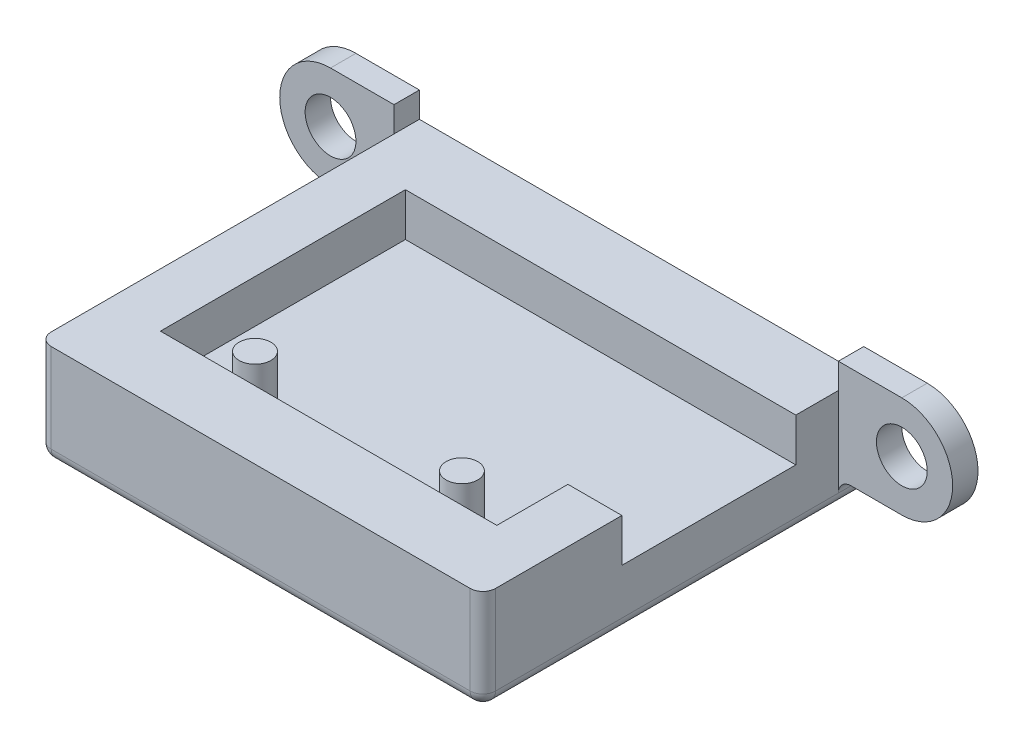
ISO-10303-21;
HEADER;
FILE_DESCRIPTION(('STEP AP214'),'2;1');
FILE_NAME('part.step','',(''),(''),'','','');
FILE_SCHEMA(('AUTOMOTIVE_DESIGN { 1 0 10303 214 1 1 1 1 }'));
ENDSEC;
DATA;
#1=APPLICATION_CONTEXT('core data for automotive mechanical design processes');
#2=APPLICATION_PROTOCOL_DEFINITION('international standard','automotive_design',2000,#1);
#3=PRODUCT_CONTEXT('',#1,'mechanical');
#4=PRODUCT('Part','Part','',(#3));
#5=PRODUCT_RELATED_PRODUCT_CATEGORY('part','',(#4));
#6=PRODUCT_DEFINITION_FORMATION('','',#4);
#7=PRODUCT_DEFINITION_CONTEXT('part definition',#1,'design');
#8=PRODUCT_DEFINITION('design','',#6,#7);
#9=PRODUCT_DEFINITION_SHAPE('','',#8);
#10=(LENGTH_UNIT() NAMED_UNIT(*) SI_UNIT(.MILLI.,.METRE.));
#11=(NAMED_UNIT(*) PLANE_ANGLE_UNIT() SI_UNIT($,.RADIAN.));
#12=(NAMED_UNIT(*) SI_UNIT($,.STERADIAN.) SOLID_ANGLE_UNIT());
#13=UNCERTAINTY_MEASURE_WITH_UNIT(LENGTH_MEASURE(1.E-05),#10,'distance_accuracy_value','');
#14=(GEOMETRIC_REPRESENTATION_CONTEXT(3) GLOBAL_UNCERTAINTY_ASSIGNED_CONTEXT((#13)) GLOBAL_UNIT_ASSIGNED_CONTEXT((#10,
#11,#12)) REPRESENTATION_CONTEXT('',''));
#15=CARTESIAN_POINT('',(0.,0.,0.));
#16=DIRECTION('',(0.,0.,1.));
#17=DIRECTION('',(1.,0.,0.));
#18=AXIS2_PLACEMENT_3D('',#15,#16,#17);
#19=CARTESIAN_POINT('',(17.5,8.,-15.));
#20=DIRECTION('',(-1.,0.,0.));
#21=DIRECTION('',(0.,0.,1.));
#22=AXIS2_PLACEMENT_3D('',#19,#20,#21);
#23=PLANE('',#22);
#24=DIRECTION('',(0.,0.,-1.));
#25=VECTOR('',#24,1.);
#26=CARTESIAN_POINT('',(17.5,1.,-15.));
#27=LINE('',#26,#25);
#28=CARTESIAN_POINT('',(17.5,1.,14.));
#29=VERTEX_POINT('',#28);
#30=CARTESIAN_POINT('',(17.5,1.,-13.));
#31=VERTEX_POINT('',#30);
#32=EDGE_CURVE('E358',#29,#31,#27,.T.);
#33=ORIENTED_EDGE('',*,*,#32,.T.);
#34=DIRECTION('',(0.,1.,0.));
#35=VECTOR('',#34,1.);
#36=CARTESIAN_POINT('',(17.5,2.,-13.));
#37=LINE('',#36,#35);
#38=CARTESIAN_POINT('',(17.5,8.,-13.));
#39=VERTEX_POINT('',#38);
#40=EDGE_CURVE('E254',#31,#39,#37,.T.);
#41=ORIENTED_EDGE('',*,*,#40,.T.);
#42=DIRECTION('',(0.,0.,-1.));
#43=VECTOR('',#42,1.);
#44=CARTESIAN_POINT('',(17.5,8.,-15.));
#45=LINE('',#44,#43);
#46=CARTESIAN_POINT('',(17.5,8.,-9.65));
#47=VERTEX_POINT('',#46);
#48=EDGE_CURVE('E340',#47,#39,#45,.T.);
#49=ORIENTED_EDGE('',*,*,#48,.F.);
#50=DIRECTION('',(0.,1.,0.));
#51=VECTOR('',#50,1.);
#52=CARTESIAN_POINT('',(17.5,4.6,-9.65));
#53=LINE('',#52,#51);
#54=CARTESIAN_POINT('',(17.5,4.6,-9.65));
#55=VERTEX_POINT('',#54);
#56=EDGE_CURVE('E330',#55,#47,#53,.T.);
#57=ORIENTED_EDGE('',*,*,#56,.F.);
#58=DIRECTION('',(0.,0.,-1.));
#59=VECTOR('',#58,1.);
#60=CARTESIAN_POINT('',(17.5,4.6,-9.65));
#61=LINE('',#60,#59);
#62=CARTESIAN_POINT('',(17.5,4.6,4.05));
#63=VERTEX_POINT('',#62);
#64=EDGE_CURVE('E299',#63,#55,#61,.T.);
#65=ORIENTED_EDGE('',*,*,#64,.F.);
#66=DIRECTION('',(0.,1.,0.));
#67=VECTOR('',#66,1.);
#68=CARTESIAN_POINT('',(17.5,4.6,4.05));
#69=LINE('',#68,#67);
#70=CARTESIAN_POINT('',(17.5,8.,4.05));
#71=VERTEX_POINT('',#70);
#72=EDGE_CURVE('E332',#63,#71,#69,.T.);
#73=ORIENTED_EDGE('',*,*,#72,.T.);
#74=CARTESIAN_POINT('',(17.5,8.,14.));
#75=VERTEX_POINT('',#74);
#76=EDGE_CURVE('E337',#75,#71,#45,.T.);
#77=ORIENTED_EDGE('',*,*,#76,.F.);
#78=DIRECTION('',(0.,-1.,0.));
#79=VECTOR('',#78,1.);
#80=CARTESIAN_POINT('',(17.5,8.,14.));
#81=LINE('',#80,#79);
#82=EDGE_CURVE('E356',#75,#29,#81,.T.);
#83=ORIENTED_EDGE('',*,*,#82,.T.);
#84=EDGE_LOOP('',(#33,#41,#49,#57,#65,#73,#77,#83));
#85=FACE_BOUND('',#84,.T.);
#86=ADVANCED_FACE('F36',(#85),#23,.F.);
#87=CARTESIAN_POINT('',(-17.5,8.,-15.));
#88=DIRECTION('',(0.,0.,1.));
#89=DIRECTION('',(1.,0.,0.));
#90=AXIS2_PLACEMENT_3D('',#87,#88,#89);
#91=PLANE('',#90);
#92=DIRECTION('',(-1.,0.,0.));
#93=VECTOR('',#92,1.);
#94=CARTESIAN_POINT('',(17.5,2.,-15.));
#95=LINE('',#94,#93);
#96=CARTESIAN_POINT('',(22.5,2.,-15.));
#97=VERTEX_POINT('',#96);
#98=CARTESIAN_POINT('',(18.5,2.,-15.));
#99=VERTEX_POINT('',#98);
#100=EDGE_CURVE('E246',#97,#99,#95,.T.);
#101=ORIENTED_EDGE('',*,*,#100,.T.);
#102=CARTESIAN_POINT('',(18.5,1.,-15.));
#103=DIRECTION('',(0.,0.,1.));
#104=DIRECTION('',(1.,0.,0.));
#105=AXIS2_PLACEMENT_3D('',#102,#103,#104);
#106=CIRCLE('',#105,1.);
#107=CARTESIAN_POINT('',(17.5,1.,-15.));
#108=VERTEX_POINT('',#107);
#109=EDGE_CURVE('E386',#99,#108,#106,.T.);
#110=ORIENTED_EDGE('',*,*,#109,.T.);
#111=CARTESIAN_POINT('',(16.5,1.,-15.));
#112=DIRECTION('',(0.,0.,1.));
#113=DIRECTION('',(1.,0.,0.));
#114=AXIS2_PLACEMENT_3D('',#111,#112,#113);
#115=CIRCLE('',#114,1.);
#116=CARTESIAN_POINT('',(16.5,0.,-15.));
#117=VERTEX_POINT('',#116);
#118=EDGE_CURVE('E363',#108,#117,#115,.F.);
#119=ORIENTED_EDGE('',*,*,#118,.T.);
#120=DIRECTION('',(-1.,0.,0.));
#121=VECTOR('',#120,1.);
#122=CARTESIAN_POINT('',(-17.5,0.,-15.));
#123=LINE('',#122,#121);
#124=CARTESIAN_POINT('',(-16.5,0.,-15.));
#125=VERTEX_POINT('',#124);
#126=EDGE_CURVE('E325',#117,#125,#123,.T.);
#127=ORIENTED_EDGE('',*,*,#126,.T.);
#128=CARTESIAN_POINT('',(-16.5,1.,-15.));
#129=DIRECTION('',(0.,0.,1.));
#130=DIRECTION('',(1.,0.,0.));
#131=AXIS2_PLACEMENT_3D('',#128,#129,#130);
#132=CIRCLE('',#131,1.);
#133=CARTESIAN_POINT('',(-17.5,1.,-15.));
#134=VERTEX_POINT('',#133);
#135=EDGE_CURVE('E361',#125,#134,#132,.F.);
#136=ORIENTED_EDGE('',*,*,#135,.T.);
#137=CARTESIAN_POINT('',(-18.5,1.,-15.));
#138=DIRECTION('',(0.,0.,1.));
#139=DIRECTION('',(1.,0.,0.));
#140=AXIS2_PLACEMENT_3D('',#137,#138,#139);
#141=CIRCLE('',#140,1.);
#142=CARTESIAN_POINT('',(-18.5,2.,-15.));
#143=VERTEX_POINT('',#142);
#144=EDGE_CURVE('E45',#134,#143,#141,.T.);
#145=ORIENTED_EDGE('',*,*,#144,.T.);
#146=DIRECTION('',(-1.,0.,0.));
#147=VECTOR('',#146,1.);
#148=CARTESIAN_POINT('',(-17.5,2.,-15.));
#149=LINE('',#148,#147);
#150=CARTESIAN_POINT('',(-22.5,2.,-15.));
#151=VERTEX_POINT('',#150);
#152=EDGE_CURVE('E224',#143,#151,#149,.T.);
#153=ORIENTED_EDGE('',*,*,#152,.T.);
#154=CARTESIAN_POINT('',(-22.5,6.,-15.));
#155=DIRECTION('',(0.,0.,-1.));
#156=DIRECTION('',(1.,0.,0.));
#157=AXIS2_PLACEMENT_3D('',#154,#155,#156);
#158=CIRCLE('',#157,4.);
#159=CARTESIAN_POINT('',(-22.5,10.,-15.));
#160=VERTEX_POINT('',#159);
#161=EDGE_CURVE('E234',#151,#160,#158,.T.);
#162=ORIENTED_EDGE('',*,*,#161,.T.);
#163=DIRECTION('',(1.,0.,0.));
#164=VECTOR('',#163,1.);
#165=CARTESIAN_POINT('',(-17.5,10.,-15.));
#166=LINE('',#165,#164);
#167=CARTESIAN_POINT('',(-17.5,10.,-15.));
#168=VERTEX_POINT('',#167);
#169=EDGE_CURVE('E204',#160,#168,#166,.T.);
#170=ORIENTED_EDGE('',*,*,#169,.T.);
#171=DIRECTION('',(0.,-1.,0.));
#172=VECTOR('',#171,1.);
#173=CARTESIAN_POINT('',(-17.5,2.,-15.));
#174=LINE('',#173,#172);
#175=CARTESIAN_POINT('',(-17.5,8.,-15.));
#176=VERTEX_POINT('',#175);
#177=EDGE_CURVE('E226',#168,#176,#174,.T.);
#178=ORIENTED_EDGE('',*,*,#177,.T.);
#179=DIRECTION('',(-1.,0.,0.));
#180=VECTOR('',#179,1.);
#181=CARTESIAN_POINT('',(-17.5,8.,-15.));
#182=LINE('',#181,#180);
#183=CARTESIAN_POINT('',(17.5,8.,-15.));
#184=VERTEX_POINT('',#183);
#185=EDGE_CURVE('E339',#184,#176,#182,.T.);
#186=ORIENTED_EDGE('',*,*,#185,.F.);
#187=DIRECTION('',(0.,1.,0.));
#188=VECTOR('',#187,1.);
#189=CARTESIAN_POINT('',(17.5,2.,-15.));
#190=LINE('',#189,#188);
#191=CARTESIAN_POINT('',(17.5,10.,-15.));
#192=VERTEX_POINT('',#191);
#193=EDGE_CURVE('E266',#184,#192,#190,.T.);
#194=ORIENTED_EDGE('',*,*,#193,.T.);
#195=DIRECTION('',(1.,0.,0.));
#196=VECTOR('',#195,1.);
#197=CARTESIAN_POINT('',(17.5,10.,-15.));
#198=LINE('',#197,#196);
#199=CARTESIAN_POINT('',(22.5,10.,-15.));
#200=VERTEX_POINT('',#199);
#201=EDGE_CURVE('E268',#192,#200,#198,.T.);
#202=ORIENTED_EDGE('',*,*,#201,.T.);
#203=CARTESIAN_POINT('',(22.5,6.,-15.));
#204=DIRECTION('',(0.,0.,-1.));
#205=DIRECTION('',(-1.,0.,0.));
#206=AXIS2_PLACEMENT_3D('',#203,#204,#205);
#207=CIRCLE('',#206,4.);
#208=EDGE_CURVE('E253',#200,#97,#207,.T.);
#209=ORIENTED_EDGE('',*,*,#208,.T.);
#210=EDGE_LOOP('',(#101,#110,#119,#127,#136,#145,#153,#162,#170,#178,#186,#194,#202,#209));
#211=FACE_BOUND('',#210,.T.);
#212=CARTESIAN_POINT('',(22.5,6.,-15.));
#213=DIRECTION('',(0.,0.,-1.));
#214=DIRECTION('',(-1.,0.,0.));
#215=AXIS2_PLACEMENT_3D('',#212,#213,#214);
#216=CIRCLE('',#215,2.);
#217=CARTESIAN_POINT('',(20.5,6.,-15.));
#218=VERTEX_POINT('',#217);
#219=EDGE_CURVE('E241',#218,#218,#216,.T.);
#220=ORIENTED_EDGE('',*,*,#219,.F.);
#221=EDGE_LOOP('',(#220));
#222=FACE_BOUND('',#221,.T.);
#223=CARTESIAN_POINT('',(-22.5,6.,-15.));
#224=DIRECTION('',(0.,0.,-1.));
#225=DIRECTION('',(1.,0.,0.));
#226=AXIS2_PLACEMENT_3D('',#223,#224,#225);
#227=CIRCLE('',#226,2.);
#228=CARTESIAN_POINT('',(-20.5,6.,-15.));
#229=VERTEX_POINT('',#228);
#230=EDGE_CURVE('E229',#229,#229,#227,.T.);
#231=ORIENTED_EDGE('',*,*,#230,.F.);
#232=EDGE_LOOP('',(#231));
#233=FACE_BOUND('',#232,.T.);
#234=ADVANCED_FACE('F436',(#211,#222,#233),#91,.F.);
#235=CARTESIAN_POINT('',(-17.5,8.,-15.));
#236=DIRECTION('',(1.,0.,0.));
#237=DIRECTION('',(0.,0.,-1.));
#238=AXIS2_PLACEMENT_3D('',#235,#236,#237);
#239=PLANE('',#238);
#240=DIRECTION('',(0.,-1.,0.));
#241=VECTOR('',#240,1.);
#242=CARTESIAN_POINT('',(-17.5,2.,-13.));
#243=LINE('',#242,#241);
#244=CARTESIAN_POINT('',(-17.5,8.,-13.));
#245=VERTEX_POINT('',#244);
#246=CARTESIAN_POINT('',(-17.5,1.,-13.));
#247=VERTEX_POINT('',#246);
#248=EDGE_CURVE('E61',#245,#247,#243,.T.);
#249=ORIENTED_EDGE('',*,*,#248,.T.);
#250=DIRECTION('',(0.,0.,1.));
#251=VECTOR('',#250,1.);
#252=CARTESIAN_POINT('',(-17.5,1.,-15.));
#253=LINE('',#252,#251);
#254=CARTESIAN_POINT('',(-17.5,1.,14.));
#255=VERTEX_POINT('',#254);
#256=EDGE_CURVE('E379',#247,#255,#253,.T.);
#257=ORIENTED_EDGE('',*,*,#256,.T.);
#258=DIRECTION('',(0.,-1.,0.));
#259=VECTOR('',#258,1.);
#260=CARTESIAN_POINT('',(-17.5,8.,14.));
#261=LINE('',#260,#259);
#262=CARTESIAN_POINT('',(-17.5,8.,14.));
#263=VERTEX_POINT('',#262);
#264=EDGE_CURVE('E377',#255,#263,#261,.F.);
#265=ORIENTED_EDGE('',*,*,#264,.T.);
#266=DIRECTION('',(0.,0.,1.));
#267=VECTOR('',#266,1.);
#268=CARTESIAN_POINT('',(-17.5,8.,-15.));
#269=LINE('',#268,#267);
#270=EDGE_CURVE('E344',#245,#263,#269,.T.);
#271=ORIENTED_EDGE('',*,*,#270,.F.);
#272=EDGE_LOOP('',(#249,#257,#265,#271));
#273=FACE_BOUND('',#272,.T.);
#274=ADVANCED_FACE('F442',(#273),#239,.F.);
#275=CARTESIAN_POINT('',(-17.5,8.,15.));
#276=DIRECTION('',(0.,0.,-1.));
#277=DIRECTION('',(-1.,0.,0.));
#278=AXIS2_PLACEMENT_3D('',#275,#276,#277);
#279=PLANE('',#278);
#280=DIRECTION('',(1.,0.,0.));
#281=VECTOR('',#280,1.);
#282=CARTESIAN_POINT('',(-17.5,8.,15.));
#283=LINE('',#282,#281);
#284=CARTESIAN_POINT('',(-16.5,8.,15.));
#285=VERTEX_POINT('',#284);
#286=CARTESIAN_POINT('',(16.5,8.,15.));
#287=VERTEX_POINT('',#286);
#288=EDGE_CURVE('E348',#285,#287,#283,.T.);
#289=ORIENTED_EDGE('',*,*,#288,.F.);
#290=DIRECTION('',(0.,-1.,0.));
#291=VECTOR('',#290,1.);
#292=CARTESIAN_POINT('',(-16.5,8.,15.));
#293=LINE('',#292,#291);
#294=CARTESIAN_POINT('',(-16.5,1.,15.));
#295=VERTEX_POINT('',#294);
#296=EDGE_CURVE('E375',#285,#295,#293,.T.);
#297=ORIENTED_EDGE('',*,*,#296,.T.);
#298=DIRECTION('',(1.,0.,0.));
#299=VECTOR('',#298,1.);
#300=CARTESIAN_POINT('',(-17.5,1.,15.));
#301=LINE('',#300,#299);
#302=CARTESIAN_POINT('',(16.5,1.,15.));
#303=VERTEX_POINT('',#302);
#304=EDGE_CURVE('E373',#295,#303,#301,.T.);
#305=ORIENTED_EDGE('',*,*,#304,.T.);
#306=DIRECTION('',(0.,-1.,0.));
#307=VECTOR('',#306,1.);
#308=CARTESIAN_POINT('',(16.5,8.,15.));
#309=LINE('',#308,#307);
#310=EDGE_CURVE('E371',#303,#287,#309,.F.);
#311=ORIENTED_EDGE('',*,*,#310,.T.);
#312=EDGE_LOOP('',(#289,#297,#305,#311));
#313=FACE_BOUND('',#312,.T.);
#314=ADVANCED_FACE('F529',(#313),#279,.F.);
#315=CARTESIAN_POINT('',(0.,8.,0.));
#316=DIRECTION('',(0.,1.,0.));
#317=DIRECTION('',(0.,0.,1.));
#318=AXIS2_PLACEMENT_3D('',#315,#316,#317);
#319=PLANE('',#318);
#320=ORIENTED_EDGE('',*,*,#270,.T.);
#321=CARTESIAN_POINT('',(-16.5,8.,14.));
#322=DIRECTION('',(0.,1.,0.));
#323=DIRECTION('',(0.,0.,1.));
#324=AXIS2_PLACEMENT_3D('',#321,#322,#323);
#325=CIRCLE('',#324,1.);
#326=EDGE_CURVE('E384',#263,#285,#325,.T.);
#327=ORIENTED_EDGE('',*,*,#326,.T.);
#328=ORIENTED_EDGE('',*,*,#288,.T.);
#329=CARTESIAN_POINT('',(16.5,8.,14.));
#330=DIRECTION('',(0.,1.,0.));
#331=DIRECTION('',(0.,0.,1.));
#332=AXIS2_PLACEMENT_3D('',#329,#330,#331);
#333=CIRCLE('',#332,1.);
#334=EDGE_CURVE('E382',#287,#75,#333,.T.);
#335=ORIENTED_EDGE('',*,*,#334,.T.);
#336=ORIENTED_EDGE('',*,*,#76,.T.);
#337=DIRECTION('',(1.,0.,0.));
#338=VECTOR('',#337,1.);
#339=CARTESIAN_POINT('',(17.5,8.,4.05));
#340=LINE('',#339,#338);
#341=CARTESIAN_POINT('',(13.25,8.,4.05));
#342=VERTEX_POINT('',#341);
#343=EDGE_CURVE('E312',#342,#71,#340,.T.);
#344=ORIENTED_EDGE('',*,*,#343,.F.);
#345=DIRECTION('',(0.,0.,-1.));
#346=VECTOR('',#345,1.);
#347=CARTESIAN_POINT('',(13.25,8.,4.05));
#348=LINE('',#347,#346);
#349=CARTESIAN_POINT('',(13.25,8.,9.65));
#350=VERTEX_POINT('',#349);
#351=EDGE_CURVE('E289',#350,#342,#348,.T.);
#352=ORIENTED_EDGE('',*,*,#351,.F.);
#353=DIRECTION('',(1.,0.,0.));
#354=VECTOR('',#353,1.);
#355=CARTESIAN_POINT('',(-13.25,8.,9.65));
#356=LINE('',#355,#354);
#357=CARTESIAN_POINT('',(-13.25,8.,9.65));
#358=VERTEX_POINT('',#357);
#359=EDGE_CURVE('E296',#358,#350,#356,.T.);
#360=ORIENTED_EDGE('',*,*,#359,.F.);
#361=DIRECTION('',(0.,0.,1.));
#362=VECTOR('',#361,1.);
#363=CARTESIAN_POINT('',(-13.25,8.,-9.65));
#364=LINE('',#363,#362);
#365=CARTESIAN_POINT('',(-13.25,8.,-9.65));
#366=VERTEX_POINT('',#365);
#367=EDGE_CURVE('E318',#366,#358,#364,.T.);
#368=ORIENTED_EDGE('',*,*,#367,.F.);
#369=DIRECTION('',(-1.,0.,0.));
#370=VECTOR('',#369,1.);
#371=CARTESIAN_POINT('',(-13.25,8.,-9.65));
#372=LINE('',#371,#370);
#373=EDGE_CURVE('E315',#47,#366,#372,.T.);
#374=ORIENTED_EDGE('',*,*,#373,.F.);
#375=ORIENTED_EDGE('',*,*,#48,.T.);
#376=EDGE_CURVE('E341',#39,#184,#45,.T.);
#377=ORIENTED_EDGE('',*,*,#376,.T.);
#378=ORIENTED_EDGE('',*,*,#185,.T.);
#379=EDGE_CURVE('E345',#176,#245,#269,.T.);
#380=ORIENTED_EDGE('',*,*,#379,.T.);
#381=EDGE_LOOP('',(#320,#327,#328,#335,#336,#344,#352,#360,#368,#374,#375,#377,#378,#380));
#382=FACE_BOUND('',#381,.T.);
#383=ADVANCED_FACE('F488',(#382),#319,.T.);
#384=CARTESIAN_POINT('',(0.,0.,0.));
#385=DIRECTION('',(0.,1.,0.));
#386=DIRECTION('',(0.,0.,1.));
#387=AXIS2_PLACEMENT_3D('',#384,#385,#386);
#388=PLANE('',#387);
#389=ORIENTED_EDGE('',*,*,#126,.F.);
#390=DIRECTION('',(0.,0.,-1.));
#391=VECTOR('',#390,1.);
#392=CARTESIAN_POINT('',(16.5,0.,0.));
#393=LINE('',#392,#391);
#394=CARTESIAN_POINT('',(16.5,0.,14.));
#395=VERTEX_POINT('',#394);
#396=EDGE_CURVE('E369',#117,#395,#393,.F.);
#397=ORIENTED_EDGE('',*,*,#396,.T.);
#398=DIRECTION('',(1.,0.,0.));
#399=VECTOR('',#398,1.);
#400=CARTESIAN_POINT('',(0.,0.,14.));
#401=LINE('',#400,#399);
#402=CARTESIAN_POINT('',(-16.5,0.,14.));
#403=VERTEX_POINT('',#402);
#404=EDGE_CURVE('E367',#395,#403,#401,.F.);
#405=ORIENTED_EDGE('',*,*,#404,.T.);
#406=DIRECTION('',(0.,0.,1.));
#407=VECTOR('',#406,1.);
#408=CARTESIAN_POINT('',(-16.5,0.,0.));
#409=LINE('',#408,#407);
#410=EDGE_CURVE('E365',#403,#125,#409,.F.);
#411=ORIENTED_EDGE('',*,*,#410,.T.);
#412=EDGE_LOOP('',(#389,#397,#405,#411));
#413=FACE_BOUND('',#412,.T.);
#414=ADVANCED_FACE('F520',(#413),#388,.F.);
#415=CARTESIAN_POINT('',(13.25,4.6,4.05));
#416=DIRECTION('',(1.,0.,0.));
#417=DIRECTION('',(0.,0.,-1.));
#418=AXIS2_PLACEMENT_3D('',#415,#416,#417);
#419=PLANE('',#418);
#420=ORIENTED_EDGE('',*,*,#351,.T.);
#421=DIRECTION('',(0.,1.,0.));
#422=VECTOR('',#421,1.);
#423=CARTESIAN_POINT('',(13.25,4.6,4.05));
#424=LINE('',#423,#422);
#425=CARTESIAN_POINT('',(13.25,4.6,4.05));
#426=VERTEX_POINT('',#425);
#427=EDGE_CURVE('E310',#426,#342,#424,.T.);
#428=ORIENTED_EDGE('',*,*,#427,.F.);
#429=DIRECTION('',(0.,0.,-1.));
#430=VECTOR('',#429,1.);
#431=CARTESIAN_POINT('',(13.25,4.6,4.05));
#432=LINE('',#431,#430);
#433=CARTESIAN_POINT('',(13.25,4.6,9.65));
#434=VERTEX_POINT('',#433);
#435=EDGE_CURVE('E292',#434,#426,#432,.T.);
#436=ORIENTED_EDGE('',*,*,#435,.F.);
#437=DIRECTION('',(0.,1.,0.));
#438=VECTOR('',#437,1.);
#439=CARTESIAN_POINT('',(13.25,4.6,9.65));
#440=LINE('',#439,#438);
#441=EDGE_CURVE('E323',#434,#350,#440,.T.);
#442=ORIENTED_EDGE('',*,*,#441,.T.);
#443=EDGE_LOOP('',(#420,#428,#436,#442));
#444=FACE_BOUND('',#443,.T.);
#445=ADVANCED_FACE('F543',(#444),#419,.F.);
#446=CARTESIAN_POINT('',(-13.25,4.6,9.65));
#447=DIRECTION('',(0.,0.,1.));
#448=DIRECTION('',(1.,0.,0.));
#449=AXIS2_PLACEMENT_3D('',#446,#447,#448);
#450=PLANE('',#449);
#451=ORIENTED_EDGE('',*,*,#359,.T.);
#452=ORIENTED_EDGE('',*,*,#441,.F.);
#453=DIRECTION('',(1.,0.,0.));
#454=VECTOR('',#453,1.);
#455=CARTESIAN_POINT('',(-13.25,4.6,9.65));
#456=LINE('',#455,#454);
#457=CARTESIAN_POINT('',(-13.25,4.6,9.65));
#458=VERTEX_POINT('',#457);
#459=EDGE_CURVE('E307',#458,#434,#456,.T.);
#460=ORIENTED_EDGE('',*,*,#459,.F.);
#461=DIRECTION('',(0.,1.,0.));
#462=VECTOR('',#461,1.);
#463=CARTESIAN_POINT('',(-13.25,4.6,9.65));
#464=LINE('',#463,#462);
#465=EDGE_CURVE('E326',#458,#358,#464,.T.);
#466=ORIENTED_EDGE('',*,*,#465,.T.);
#467=EDGE_LOOP('',(#451,#452,#460,#466));
#468=FACE_BOUND('',#467,.T.);
#469=ADVANCED_FACE('F550',(#468),#450,.F.);
#470=CARTESIAN_POINT('',(-13.25,4.6,-9.65));
#471=DIRECTION('',(-1.,0.,0.));
#472=DIRECTION('',(0.,0.,1.));
#473=AXIS2_PLACEMENT_3D('',#470,#471,#472);
#474=PLANE('',#473);
#475=ORIENTED_EDGE('',*,*,#367,.T.);
#476=ORIENTED_EDGE('',*,*,#465,.F.);
#477=DIRECTION('',(0.,0.,1.));
#478=VECTOR('',#477,1.);
#479=CARTESIAN_POINT('',(-13.25,4.6,-9.65));
#480=LINE('',#479,#478);
#481=CARTESIAN_POINT('',(-13.25,4.6,-9.65));
#482=VERTEX_POINT('',#481);
#483=EDGE_CURVE('E304',#482,#458,#480,.T.);
#484=ORIENTED_EDGE('',*,*,#483,.F.);
#485=DIRECTION('',(0.,1.,0.));
#486=VECTOR('',#485,1.);
#487=CARTESIAN_POINT('',(-13.25,4.6,-9.65));
#488=LINE('',#487,#486);
#489=EDGE_CURVE('E328',#482,#366,#488,.T.);
#490=ORIENTED_EDGE('',*,*,#489,.T.);
#491=EDGE_LOOP('',(#475,#476,#484,#490));
#492=FACE_BOUND('',#491,.T.);
#493=ADVANCED_FACE('F560',(#492),#474,.F.);
#494=CARTESIAN_POINT('',(-13.25,4.6,-9.65));
#495=DIRECTION('',(0.,0.,-1.));
#496=DIRECTION('',(-1.,0.,0.));
#497=AXIS2_PLACEMENT_3D('',#494,#495,#496);
#498=PLANE('',#497);
#499=ORIENTED_EDGE('',*,*,#373,.T.);
#500=ORIENTED_EDGE('',*,*,#489,.F.);
#501=DIRECTION('',(-1.,0.,0.));
#502=VECTOR('',#501,1.);
#503=CARTESIAN_POINT('',(13.25,4.6,-9.65));
#504=LINE('',#503,#502);
#505=EDGE_CURVE('E302',#55,#482,#504,.T.);
#506=ORIENTED_EDGE('',*,*,#505,.F.);
#507=ORIENTED_EDGE('',*,*,#56,.T.);
#508=EDGE_LOOP('',(#499,#500,#506,#507));
#509=FACE_BOUND('',#508,.T.);
#510=ADVANCED_FACE('F556',(#509),#498,.F.);
#511=CARTESIAN_POINT('',(17.5,4.6,4.05));
#512=DIRECTION('',(0.,0.,1.));
#513=DIRECTION('',(1.,0.,0.));
#514=AXIS2_PLACEMENT_3D('',#511,#512,#513);
#515=PLANE('',#514);
#516=ORIENTED_EDGE('',*,*,#343,.T.);
#517=ORIENTED_EDGE('',*,*,#72,.F.);
#518=DIRECTION('',(1.,0.,0.));
#519=VECTOR('',#518,1.);
#520=CARTESIAN_POINT('',(17.5,4.6,4.05));
#521=LINE('',#520,#519);
#522=EDGE_CURVE('E295',#426,#63,#521,.T.);
#523=ORIENTED_EDGE('',*,*,#522,.F.);
#524=ORIENTED_EDGE('',*,*,#427,.T.);
#525=EDGE_LOOP('',(#516,#517,#523,#524));
#526=FACE_BOUND('',#525,.T.);
#527=ADVANCED_FACE('F552',(#526),#515,.F.);
#528=CARTESIAN_POINT('',(0.,4.6,0.));
#529=DIRECTION('',(0.,1.,0.));
#530=DIRECTION('',(0.,0.,1.));
#531=AXIS2_PLACEMENT_3D('',#528,#529,#530);
#532=PLANE('',#531);
#533=CARTESIAN_POINT('',(8.15,4.6,7.3));
#534=DIRECTION('',(0.,1.,0.));
#535=DIRECTION('',(0.,0.,1.));
#536=AXIS2_PLACEMENT_3D('',#533,#534,#535);
#537=CIRCLE('',#536,1.25);
#538=CARTESIAN_POINT('',(8.15,4.6,8.55));
#539=VERTEX_POINT('',#538);
#540=EDGE_CURVE('E280',#539,#539,#537,.T.);
#541=ORIENTED_EDGE('',*,*,#540,.F.);
#542=EDGE_LOOP('',(#541));
#543=FACE_BOUND('',#542,.T.);
#544=CARTESIAN_POINT('',(-8.15,4.6,7.3));
#545=DIRECTION('',(0.,1.,0.));
#546=DIRECTION('',(0.,0.,1.));
#547=AXIS2_PLACEMENT_3D('',#544,#545,#546);
#548=CIRCLE('',#547,1.25);
#549=CARTESIAN_POINT('',(-8.15,4.6,8.55));
#550=VERTEX_POINT('',#549);
#551=EDGE_CURVE('E286',#550,#550,#548,.T.);
#552=ORIENTED_EDGE('',*,*,#551,.F.);
#553=EDGE_LOOP('',(#552));
#554=FACE_BOUND('',#553,.T.);
#555=ORIENTED_EDGE('',*,*,#435,.T.);
#556=ORIENTED_EDGE('',*,*,#522,.T.);
#557=ORIENTED_EDGE('',*,*,#64,.T.);
#558=ORIENTED_EDGE('',*,*,#505,.T.);
#559=ORIENTED_EDGE('',*,*,#483,.T.);
#560=ORIENTED_EDGE('',*,*,#459,.T.);
#561=EDGE_LOOP('',(#555,#556,#557,#558,#559,#560));
#562=FACE_BOUND('',#561,.T.);
#563=ADVANCED_FACE('F555',(#543,#554,#562),#532,.T.);
#564=CARTESIAN_POINT('',(-8.15,4.6,7.3));
#565=DIRECTION('',(0.,1.,0.));
#566=DIRECTION('',(0.,0.,1.));
#567=AXIS2_PLACEMENT_3D('',#564,#565,#566);
#568=CYLINDRICAL_SURFACE('',#567,1.25);
#569=ORIENTED_EDGE('',*,*,#551,.T.);
#570=EDGE_LOOP('',(#569));
#571=FACE_BOUND('',#570,.T.);
#572=CARTESIAN_POINT('',(-8.15,8.,7.3));
#573=DIRECTION('',(0.,1.,0.));
#574=DIRECTION('',(0.,0.,1.));
#575=AXIS2_PLACEMENT_3D('',#572,#573,#574);
#576=CIRCLE('',#575,1.25);
#577=CARTESIAN_POINT('',(-8.15,8.,8.55));
#578=VERTEX_POINT('',#577);
#579=EDGE_CURVE('E283',#578,#578,#576,.T.);
#580=ORIENTED_EDGE('',*,*,#579,.F.);
#581=EDGE_LOOP('',(#580));
#582=FACE_BOUND('',#581,.T.);
#583=ADVANCED_FACE('F570',(#571,#582),#568,.T.);
#584=CARTESIAN_POINT('',(8.15,4.6,7.3));
#585=DIRECTION('',(0.,1.,0.));
#586=DIRECTION('',(0.,0.,1.));
#587=AXIS2_PLACEMENT_3D('',#584,#585,#586);
#588=CYLINDRICAL_SURFACE('',#587,1.25);
#589=ORIENTED_EDGE('',*,*,#540,.T.);
#590=EDGE_LOOP('',(#589));
#591=FACE_BOUND('',#590,.T.);
#592=CARTESIAN_POINT('',(8.15,8.,7.3));
#593=DIRECTION('',(0.,1.,0.));
#594=DIRECTION('',(0.,0.,1.));
#595=AXIS2_PLACEMENT_3D('',#592,#593,#594);
#596=CIRCLE('',#595,1.25);
#597=CARTESIAN_POINT('',(8.15,8.,8.55));
#598=VERTEX_POINT('',#597);
#599=EDGE_CURVE('E275',#598,#598,#596,.T.);
#600=ORIENTED_EDGE('',*,*,#599,.F.);
#601=EDGE_LOOP('',(#600));
#602=FACE_BOUND('',#601,.T.);
#603=ADVANCED_FACE('F574',(#591,#602),#588,.T.);
#604=ORIENTED_EDGE('',*,*,#579,.T.);
#605=EDGE_LOOP('',(#604));
#606=FACE_BOUND('',#605,.T.);
#607=ADVANCED_FACE('F546',(#606),#319,.T.);
#608=ORIENTED_EDGE('',*,*,#599,.T.);
#609=EDGE_LOOP('',(#608));
#610=FACE_BOUND('',#609,.T.);
#611=ADVANCED_FACE('F547',(#610),#319,.T.);
#612=CARTESIAN_POINT('',(17.5,2.,-13.));
#613=DIRECTION('',(-1.,0.,0.));
#614=DIRECTION('',(0.,0.,1.));
#615=AXIS2_PLACEMENT_3D('',#612,#613,#614);
#616=PLANE('',#615);
#617=ORIENTED_EDGE('',*,*,#376,.F.);
#618=CARTESIAN_POINT('',(17.5,10.,-13.));
#619=VERTEX_POINT('',#618);
#620=EDGE_CURVE('E252',#39,#619,#37,.T.);
#621=ORIENTED_EDGE('',*,*,#620,.T.);
#622=DIRECTION('',(0.,0.,-1.));
#623=VECTOR('',#622,1.);
#624=CARTESIAN_POINT('',(17.5,10.,-13.));
#625=LINE('',#624,#623);
#626=EDGE_CURVE('E263',#619,#192,#625,.T.);
#627=ORIENTED_EDGE('',*,*,#626,.T.);
#628=ORIENTED_EDGE('',*,*,#193,.F.);
#629=EDGE_LOOP('',(#617,#621,#627,#628));
#630=FACE_BOUND('',#629,.T.);
#631=ADVANCED_FACE('F494',(#630),#616,.T.);
#632=CARTESIAN_POINT('',(17.5,2.,-13.));
#633=DIRECTION('',(0.,-1.,0.));
#634=DIRECTION('',(1.,0.,0.));
#635=AXIS2_PLACEMENT_3D('',#632,#633,#634);
#636=PLANE('',#635);
#637=DIRECTION('',(-1.,0.,0.));
#638=VECTOR('',#637,1.);
#639=CARTESIAN_POINT('',(17.5,2.,-13.));
#640=LINE('',#639,#638);
#641=CARTESIAN_POINT('',(22.5,2.,-13.));
#642=VERTEX_POINT('',#641);
#643=CARTESIAN_POINT('',(18.5,2.,-13.));
#644=VERTEX_POINT('',#643);
#645=EDGE_CURVE('E249',#642,#644,#640,.T.);
#646=ORIENTED_EDGE('',*,*,#645,.T.);
#647=DIRECTION('',(0.,0.,-1.));
#648=VECTOR('',#647,1.);
#649=CARTESIAN_POINT('',(18.5,2.,-13.));
#650=LINE('',#649,#648);
#651=EDGE_CURVE('E353',#644,#99,#650,.T.);
#652=ORIENTED_EDGE('',*,*,#651,.T.);
#653=ORIENTED_EDGE('',*,*,#100,.F.);
#654=DIRECTION('',(0.,0.,-1.));
#655=VECTOR('',#654,1.);
#656=CARTESIAN_POINT('',(22.5,2.,-13.));
#657=LINE('',#656,#655);
#658=EDGE_CURVE('E273',#642,#97,#657,.T.);
#659=ORIENTED_EDGE('',*,*,#658,.F.);
#660=EDGE_LOOP('',(#646,#652,#653,#659));
#661=FACE_BOUND('',#660,.T.);
#662=ADVANCED_FACE('F513',(#661),#636,.T.);
#663=CARTESIAN_POINT('',(22.5,6.,-13.));
#664=DIRECTION('',(0.,0.,-1.));
#665=DIRECTION('',(-1.,0.,0.));
#666=AXIS2_PLACEMENT_3D('',#663,#664,#665);
#667=CYLINDRICAL_SURFACE('',#666,4.);
#668=ORIENTED_EDGE('',*,*,#208,.F.);
#669=DIRECTION('',(0.,0.,-1.));
#670=VECTOR('',#669,1.);
#671=CARTESIAN_POINT('',(22.5,10.,-13.));
#672=LINE('',#671,#670);
#673=CARTESIAN_POINT('',(22.5,10.,-13.));
#674=VERTEX_POINT('',#673);
#675=EDGE_CURVE('E276',#674,#200,#672,.T.);
#676=ORIENTED_EDGE('',*,*,#675,.F.);
#677=CARTESIAN_POINT('',(22.5,6.,-13.));
#678=DIRECTION('',(0.,0.,-1.));
#679=DIRECTION('',(-1.,0.,0.));
#680=AXIS2_PLACEMENT_3D('',#677,#678,#679);
#681=CIRCLE('',#680,4.);
#682=EDGE_CURVE('E260',#674,#642,#681,.T.);
#683=ORIENTED_EDGE('',*,*,#682,.T.);
#684=ORIENTED_EDGE('',*,*,#658,.T.);
#685=EDGE_LOOP('',(#668,#676,#683,#684));
#686=FACE_BOUND('',#685,.T.);
#687=ADVANCED_FACE('F510',(#686),#667,.T.);
#688=CARTESIAN_POINT('',(17.5,10.,-13.));
#689=DIRECTION('',(0.,1.,0.));
#690=DIRECTION('',(-1.,0.,0.));
#691=AXIS2_PLACEMENT_3D('',#688,#689,#690);
#692=PLANE('',#691);
#693=ORIENTED_EDGE('',*,*,#201,.F.);
#694=ORIENTED_EDGE('',*,*,#626,.F.);
#695=DIRECTION('',(1.,0.,0.));
#696=VECTOR('',#695,1.);
#697=CARTESIAN_POINT('',(17.5,10.,-13.));
#698=LINE('',#697,#696);
#699=EDGE_CURVE('E257',#619,#674,#698,.T.);
#700=ORIENTED_EDGE('',*,*,#699,.T.);
#701=ORIENTED_EDGE('',*,*,#675,.T.);
#702=EDGE_LOOP('',(#693,#694,#700,#701));
#703=FACE_BOUND('',#702,.T.);
#704=ADVANCED_FACE('F507',(#703),#692,.T.);
#705=CARTESIAN_POINT('',(22.5,6.,-13.));
#706=DIRECTION('',(0.,0.,-1.));
#707=DIRECTION('',(-1.,0.,0.));
#708=AXIS2_PLACEMENT_3D('',#705,#706,#707);
#709=PLANE('',#708);
#710=CARTESIAN_POINT('',(22.5,6.,-13.));
#711=DIRECTION('',(0.,0.,-1.));
#712=DIRECTION('',(-1.,0.,0.));
#713=AXIS2_PLACEMENT_3D('',#710,#711,#712);
#714=CIRCLE('',#713,2.);
#715=CARTESIAN_POINT('',(20.5,6.,-13.));
#716=VERTEX_POINT('',#715);
#717=EDGE_CURVE('E243',#716,#716,#714,.T.);
#718=ORIENTED_EDGE('',*,*,#717,.T.);
#719=EDGE_LOOP('',(#718));
#720=FACE_BOUND('',#719,.T.);
#721=ORIENTED_EDGE('',*,*,#645,.F.);
#722=ORIENTED_EDGE('',*,*,#682,.F.);
#723=ORIENTED_EDGE('',*,*,#699,.F.);
#724=ORIENTED_EDGE('',*,*,#620,.F.);
#725=ORIENTED_EDGE('',*,*,#40,.F.);
#726=CARTESIAN_POINT('',(18.5,1.,-13.));
#727=DIRECTION('',(0.,0.,-1.));
#728=DIRECTION('',(-1.,0.,0.));
#729=AXIS2_PLACEMENT_3D('',#726,#727,#728);
#730=CIRCLE('',#729,1.);
#731=EDGE_CURVE('E388',#31,#644,#730,.T.);
#732=ORIENTED_EDGE('',*,*,#731,.T.);
#733=EDGE_LOOP('',(#721,#722,#723,#724,#725,#732));
#734=FACE_BOUND('',#733,.T.);
#735=ADVANCED_FACE('F501',(#720,#734),#709,.F.);
#736=CARTESIAN_POINT('',(22.5,6.,-13.));
#737=DIRECTION('',(0.,0.,-1.));
#738=DIRECTION('',(-1.,0.,0.));
#739=AXIS2_PLACEMENT_3D('',#736,#737,#738);
#740=CYLINDRICAL_SURFACE('',#739,2.);
#741=ORIENTED_EDGE('',*,*,#717,.F.);
#742=EDGE_LOOP('',(#741));
#743=FACE_BOUND('',#742,.T.);
#744=ORIENTED_EDGE('',*,*,#219,.T.);
#745=EDGE_LOOP('',(#744));
#746=FACE_BOUND('',#745,.T.);
#747=ADVANCED_FACE('F589',(#743,#746),#740,.F.);
#748=CARTESIAN_POINT('',(-17.5,2.,-13.));
#749=DIRECTION('',(1.,0.,0.));
#750=DIRECTION('',(0.,0.,-1.));
#751=AXIS2_PLACEMENT_3D('',#748,#749,#750);
#752=PLANE('',#751);
#753=ORIENTED_EDGE('',*,*,#379,.F.);
#754=ORIENTED_EDGE('',*,*,#177,.F.);
#755=DIRECTION('',(0.,0.,-1.));
#756=VECTOR('',#755,1.);
#757=CARTESIAN_POINT('',(-17.5,10.,-13.));
#758=LINE('',#757,#756);
#759=CARTESIAN_POINT('',(-17.5,10.,-13.));
#760=VERTEX_POINT('',#759);
#761=EDGE_CURVE('E209',#760,#168,#758,.T.);
#762=ORIENTED_EDGE('',*,*,#761,.F.);
#763=EDGE_CURVE('E218',#760,#245,#243,.T.);
#764=ORIENTED_EDGE('',*,*,#763,.T.);
#765=EDGE_LOOP('',(#753,#754,#762,#764));
#766=FACE_BOUND('',#765,.T.);
#767=ADVANCED_FACE('F593',(#766),#752,.T.);
#768=CARTESIAN_POINT('',(-22.5,6.,-13.));
#769=DIRECTION('',(0.,0.,-1.));
#770=DIRECTION('',(-1.,0.,0.));
#771=AXIS2_PLACEMENT_3D('',#768,#769,#770);
#772=CYLINDRICAL_SURFACE('',#771,4.);
#773=ORIENTED_EDGE('',*,*,#161,.F.);
#774=DIRECTION('',(0.,0.,-1.));
#775=VECTOR('',#774,1.);
#776=CARTESIAN_POINT('',(-22.5,2.,-13.));
#777=LINE('',#776,#775);
#778=CARTESIAN_POINT('',(-22.5,2.,-13.));
#779=VERTEX_POINT('',#778);
#780=EDGE_CURVE('E223',#779,#151,#777,.T.);
#781=ORIENTED_EDGE('',*,*,#780,.F.);
#782=CARTESIAN_POINT('',(-22.5,6.,-13.));
#783=DIRECTION('',(0.,0.,-1.));
#784=DIRECTION('',(1.,0.,0.));
#785=AXIS2_PLACEMENT_3D('',#782,#783,#784);
#786=CIRCLE('',#785,4.);
#787=CARTESIAN_POINT('',(-22.5,10.,-13.));
#788=VERTEX_POINT('',#787);
#789=EDGE_CURVE('E216',#779,#788,#786,.T.);
#790=ORIENTED_EDGE('',*,*,#789,.T.);
#791=DIRECTION('',(0.,0.,-1.));
#792=VECTOR('',#791,1.);
#793=CARTESIAN_POINT('',(-22.5,10.,-13.));
#794=LINE('',#793,#792);
#795=EDGE_CURVE('E199',#788,#160,#794,.T.);
#796=ORIENTED_EDGE('',*,*,#795,.T.);
#797=EDGE_LOOP('',(#773,#781,#790,#796));
#798=FACE_BOUND('',#797,.T.);
#799=ADVANCED_FACE('F221',(#798),#772,.T.);
#800=CARTESIAN_POINT('',(-17.5,2.,-13.));
#801=DIRECTION('',(0.,-1.,0.));
#802=DIRECTION('',(1.,0.,0.));
#803=AXIS2_PLACEMENT_3D('',#800,#801,#802);
#804=PLANE('',#803);
#805=ORIENTED_EDGE('',*,*,#152,.F.);
#806=DIRECTION('',(0.,0.,-1.));
#807=VECTOR('',#806,1.);
#808=CARTESIAN_POINT('',(-18.5,2.,-13.));
#809=LINE('',#808,#807);
#810=CARTESIAN_POINT('',(-18.5,2.,-13.));
#811=VERTEX_POINT('',#810);
#812=EDGE_CURVE('E53',#143,#811,#809,.F.);
#813=ORIENTED_EDGE('',*,*,#812,.T.);
#814=DIRECTION('',(-1.,0.,0.));
#815=VECTOR('',#814,1.);
#816=CARTESIAN_POINT('',(-17.5,2.,-13.));
#817=LINE('',#816,#815);
#818=EDGE_CURVE('E210',#811,#779,#817,.T.);
#819=ORIENTED_EDGE('',*,*,#818,.T.);
#820=ORIENTED_EDGE('',*,*,#780,.T.);
#821=EDGE_LOOP('',(#805,#813,#819,#820));
#822=FACE_BOUND('',#821,.T.);
#823=ADVANCED_FACE('F481',(#822),#804,.T.);
#824=CARTESIAN_POINT('',(-17.5,10.,-13.));
#825=DIRECTION('',(0.,1.,0.));
#826=DIRECTION('',(-1.,0.,0.));
#827=AXIS2_PLACEMENT_3D('',#824,#825,#826);
#828=PLANE('',#827);
#829=ORIENTED_EDGE('',*,*,#169,.F.);
#830=ORIENTED_EDGE('',*,*,#795,.F.);
#831=DIRECTION('',(1.,0.,0.));
#832=VECTOR('',#831,1.);
#833=CARTESIAN_POINT('',(-17.5,10.,-13.));
#834=LINE('',#833,#832);
#835=EDGE_CURVE('E202',#788,#760,#834,.T.);
#836=ORIENTED_EDGE('',*,*,#835,.T.);
#837=ORIENTED_EDGE('',*,*,#761,.T.);
#838=EDGE_LOOP('',(#829,#830,#836,#837));
#839=FACE_BOUND('',#838,.T.);
#840=ADVANCED_FACE('F201',(#839),#828,.T.);
#841=CARTESIAN_POINT('',(-22.5,6.,-13.));
#842=DIRECTION('',(0.,0.,1.));
#843=DIRECTION('',(1.,0.,0.));
#844=AXIS2_PLACEMENT_3D('',#841,#842,#843);
#845=PLANE('',#844);
#846=CARTESIAN_POINT('',(-22.5,6.,-13.));
#847=DIRECTION('',(0.,0.,-1.));
#848=DIRECTION('',(1.,0.,0.));
#849=AXIS2_PLACEMENT_3D('',#846,#847,#848);
#850=CIRCLE('',#849,2.);
#851=CARTESIAN_POINT('',(-20.5,6.,-13.));
#852=VERTEX_POINT('',#851);
#853=EDGE_CURVE('E236',#852,#852,#850,.T.);
#854=ORIENTED_EDGE('',*,*,#853,.T.);
#855=EDGE_LOOP('',(#854));
#856=FACE_BOUND('',#855,.T.);
#857=ORIENTED_EDGE('',*,*,#789,.F.);
#858=ORIENTED_EDGE('',*,*,#818,.F.);
#859=CARTESIAN_POINT('',(-18.5,1.,-13.));
#860=DIRECTION('',(0.,0.,1.));
#861=DIRECTION('',(1.,0.,0.));
#862=AXIS2_PLACEMENT_3D('',#859,#860,#861);
#863=CIRCLE('',#862,1.);
#864=EDGE_CURVE('E11',#811,#247,#863,.F.);
#865=ORIENTED_EDGE('',*,*,#864,.T.);
#866=ORIENTED_EDGE('',*,*,#248,.F.);
#867=ORIENTED_EDGE('',*,*,#763,.F.);
#868=ORIENTED_EDGE('',*,*,#835,.F.);
#869=EDGE_LOOP('',(#857,#858,#865,#866,#867,#868));
#870=FACE_BOUND('',#869,.T.);
#871=ADVANCED_FACE('F215',(#856,#870),#845,.T.);
#872=CARTESIAN_POINT('',(-22.5,6.,-13.));
#873=DIRECTION('',(0.,0.,-1.));
#874=DIRECTION('',(-1.,0.,0.));
#875=AXIS2_PLACEMENT_3D('',#872,#873,#874);
#876=CYLINDRICAL_SURFACE('',#875,2.);
#877=ORIENTED_EDGE('',*,*,#853,.F.);
#878=EDGE_LOOP('',(#877));
#879=FACE_BOUND('',#878,.T.);
#880=ORIENTED_EDGE('',*,*,#230,.T.);
#881=EDGE_LOOP('',(#880));
#882=FACE_BOUND('',#881,.T.);
#883=ADVANCED_FACE('F425',(#879,#882),#876,.F.);
#884=CARTESIAN_POINT('',(-18.5,1.,-15.));
#885=DIRECTION('',(0.,0.,-1.));
#886=DIRECTION('',(-1.,0.,0.));
#887=AXIS2_PLACEMENT_3D('',#884,#885,#886);
#888=CYLINDRICAL_SURFACE('',#887,1.);
#889=ORIENTED_EDGE('',*,*,#812,.F.);
#890=ORIENTED_EDGE('',*,*,#144,.F.);
#891=DIRECTION('',(0.,0.,-1.));
#892=VECTOR('',#891,1.);
#893=CARTESIAN_POINT('',(-17.5,1.,-15.));
#894=LINE('',#893,#892);
#895=EDGE_CURVE('E40',#247,#134,#894,.T.);
#896=ORIENTED_EDGE('',*,*,#895,.F.);
#897=ORIENTED_EDGE('',*,*,#864,.F.);
#898=EDGE_LOOP('',(#889,#890,#896,#897));
#899=FACE_BOUND('',#898,.T.);
#900=ADVANCED_FACE('F38',(#899),#888,.F.);
#901=CARTESIAN_POINT('',(-16.5,1.,-15.));
#902=DIRECTION('',(0.,0.,1.));
#903=DIRECTION('',(1.,0.,0.));
#904=AXIS2_PLACEMENT_3D('',#901,#902,#903);
#905=CYLINDRICAL_SURFACE('',#904,1.);
#906=ORIENTED_EDGE('',*,*,#135,.F.);
#907=ORIENTED_EDGE('',*,*,#410,.F.);
#908=CARTESIAN_POINT('',(-16.5,1.,14.));
#909=DIRECTION('',(0.,0.,1.));
#910=DIRECTION('',(1.,0.,0.));
#911=AXIS2_PLACEMENT_3D('',#908,#909,#910);
#912=CIRCLE('',#911,1.);
#913=EDGE_CURVE('E408',#255,#403,#912,.T.);
#914=ORIENTED_EDGE('',*,*,#913,.F.);
#915=ORIENTED_EDGE('',*,*,#256,.F.);
#916=ORIENTED_EDGE('',*,*,#895,.T.);
#917=EDGE_LOOP('',(#906,#907,#914,#915,#916));
#918=FACE_BOUND('',#917,.T.);
#919=ADVANCED_FACE('F432',(#918),#905,.T.);
#920=CARTESIAN_POINT('',(-16.5,8.,14.));
#921=DIRECTION('',(0.,-1.,0.));
#922=DIRECTION('',(0.,0.,-1.));
#923=AXIS2_PLACEMENT_3D('',#920,#921,#922);
#924=CYLINDRICAL_SURFACE('',#923,1.);
#925=ORIENTED_EDGE('',*,*,#326,.F.);
#926=ORIENTED_EDGE('',*,*,#264,.F.);
#927=CARTESIAN_POINT('',(-16.5,1.,14.));
#928=DIRECTION('',(0.,-1.,0.));
#929=DIRECTION('',(0.,0.,-1.));
#930=AXIS2_PLACEMENT_3D('',#927,#928,#929);
#931=CIRCLE('',#930,1.);
#932=EDGE_CURVE('E406',#295,#255,#931,.T.);
#933=ORIENTED_EDGE('',*,*,#932,.F.);
#934=ORIENTED_EDGE('',*,*,#296,.F.);
#935=EDGE_LOOP('',(#925,#926,#933,#934));
#936=FACE_BOUND('',#935,.T.);
#937=ADVANCED_FACE('F470',(#936),#924,.T.);
#938=CARTESIAN_POINT('',(-16.5,1.,14.));
#939=DIRECTION('',(-1.,0.,0.));
#940=DIRECTION('',(0.,0.,1.));
#941=AXIS2_PLACEMENT_3D('',#938,#939,#940);
#942=SPHERICAL_SURFACE('',#941,1.);
#943=ORIENTED_EDGE('',*,*,#932,.T.);
#944=ORIENTED_EDGE('',*,*,#913,.T.);
#945=CARTESIAN_POINT('',(-16.5,1.,14.));
#946=DIRECTION('',(-1.,0.,0.));
#947=DIRECTION('',(0.,0.,1.));
#948=AXIS2_PLACEMENT_3D('',#945,#946,#947);
#949=CIRCLE('',#948,1.);
#950=EDGE_CURVE('E403',#295,#403,#949,.F.);
#951=ORIENTED_EDGE('',*,*,#950,.F.);
#952=EDGE_LOOP('',(#943,#944,#951));
#953=FACE_BOUND('',#952,.T.);
#954=ADVANCED_FACE('F466',(#953),#942,.T.);
#955=CARTESIAN_POINT('',(-17.5,1.,14.));
#956=DIRECTION('',(1.,0.,0.));
#957=DIRECTION('',(0.,0.,-1.));
#958=AXIS2_PLACEMENT_3D('',#955,#956,#957);
#959=CYLINDRICAL_SURFACE('',#958,1.);
#960=ORIENTED_EDGE('',*,*,#950,.T.);
#961=ORIENTED_EDGE('',*,*,#404,.F.);
#962=CARTESIAN_POINT('',(16.5,1.,14.));
#963=DIRECTION('',(1.,0.,0.));
#964=DIRECTION('',(0.,0.,-1.));
#965=AXIS2_PLACEMENT_3D('',#962,#963,#964);
#966=CIRCLE('',#965,1.);
#967=EDGE_CURVE('E400',#303,#395,#966,.T.);
#968=ORIENTED_EDGE('',*,*,#967,.F.);
#969=ORIENTED_EDGE('',*,*,#304,.F.);
#970=EDGE_LOOP('',(#960,#961,#968,#969));
#971=FACE_BOUND('',#970,.T.);
#972=ADVANCED_FACE('F462',(#971),#959,.T.);
#973=CARTESIAN_POINT('',(16.5,8.,14.));
#974=DIRECTION('',(0.,-1.,0.));
#975=DIRECTION('',(0.,0.,-1.));
#976=AXIS2_PLACEMENT_3D('',#973,#974,#975);
#977=CYLINDRICAL_SURFACE('',#976,1.);
#978=ORIENTED_EDGE('',*,*,#334,.F.);
#979=ORIENTED_EDGE('',*,*,#310,.F.);
#980=CARTESIAN_POINT('',(16.5,1.,14.));
#981=DIRECTION('',(0.,-1.,0.));
#982=DIRECTION('',(0.,0.,-1.));
#983=AXIS2_PLACEMENT_3D('',#980,#981,#982);
#984=CIRCLE('',#983,1.);
#985=EDGE_CURVE('E397',#29,#303,#984,.T.);
#986=ORIENTED_EDGE('',*,*,#985,.F.);
#987=ORIENTED_EDGE('',*,*,#82,.F.);
#988=EDGE_LOOP('',(#978,#979,#986,#987));
#989=FACE_BOUND('',#988,.T.);
#990=ADVANCED_FACE('F458',(#989),#977,.T.);
#991=CARTESIAN_POINT('',(16.5,1.,14.));
#992=DIRECTION('',(0.,0.,1.));
#993=DIRECTION('',(1.,0.,0.));
#994=AXIS2_PLACEMENT_3D('',#991,#992,#993);
#995=SPHERICAL_SURFACE('',#994,1.);
#996=ORIENTED_EDGE('',*,*,#985,.T.);
#997=ORIENTED_EDGE('',*,*,#967,.T.);
#998=CARTESIAN_POINT('',(16.5,1.,14.));
#999=DIRECTION('',(0.,0.,1.));
#1000=DIRECTION('',(1.,0.,0.));
#1001=AXIS2_PLACEMENT_3D('',#998,#999,#1000);
#1002=CIRCLE('',#1001,1.);
#1003=EDGE_CURVE('E394',#29,#395,#1002,.F.);
#1004=ORIENTED_EDGE('',*,*,#1003,.F.);
#1005=EDGE_LOOP('',(#996,#997,#1004));
#1006=FACE_BOUND('',#1005,.T.);
#1007=ADVANCED_FACE('F454',(#1006),#995,.T.);
#1008=CARTESIAN_POINT('',(16.5,1.,-15.));
#1009=DIRECTION('',(0.,0.,-1.));
#1010=DIRECTION('',(-1.,0.,0.));
#1011=AXIS2_PLACEMENT_3D('',#1008,#1009,#1010);
#1012=CYLINDRICAL_SURFACE('',#1011,1.);
#1013=DIRECTION('',(0.,0.,-1.));
#1014=VECTOR('',#1013,1.);
#1015=CARTESIAN_POINT('',(17.5,1.,-15.));
#1016=LINE('',#1015,#1014);
#1017=EDGE_CURVE('E391',#31,#108,#1016,.T.);
#1018=ORIENTED_EDGE('',*,*,#1017,.F.);
#1019=ORIENTED_EDGE('',*,*,#32,.F.);
#1020=ORIENTED_EDGE('',*,*,#1003,.T.);
#1021=ORIENTED_EDGE('',*,*,#396,.F.);
#1022=ORIENTED_EDGE('',*,*,#118,.F.);
#1023=EDGE_LOOP('',(#1018,#1019,#1020,#1021,#1022));
#1024=FACE_BOUND('',#1023,.T.);
#1025=ADVANCED_FACE('F450',(#1024),#1012,.T.);
#1026=CARTESIAN_POINT('',(18.5,1.,-13.));
#1027=DIRECTION('',(0.,0.,-1.));
#1028=DIRECTION('',(-1.,0.,0.));
#1029=AXIS2_PLACEMENT_3D('',#1026,#1027,#1028);
#1030=CYLINDRICAL_SURFACE('',#1029,1.);
#1031=ORIENTED_EDGE('',*,*,#731,.F.);
#1032=ORIENTED_EDGE('',*,*,#1017,.T.);
#1033=ORIENTED_EDGE('',*,*,#109,.F.);
#1034=ORIENTED_EDGE('',*,*,#651,.F.);
#1035=EDGE_LOOP('',(#1031,#1032,#1033,#1034));
#1036=FACE_BOUND('',#1035,.T.);
#1037=ADVANCED_FACE('F447',(#1036),#1030,.F.);
#1038=CLOSED_SHELL('',(#86,#234,#274,#314,#383,#414,#445,#469,#493,#510,#527,#563,#583,#603,
#607,#611,#631,#662,#687,#704,#735,#747,#767,#799,#823,#840,#871,#883,#900,#919,#937,#954,#972,
#990,#1007,#1025,#1037));
#1039=MANIFOLD_SOLID_BREP('B2',#1038);
#1040=ADVANCED_BREP_SHAPE_REPRESENTATION('',(#18,#1039),#14);
#1041=SHAPE_DEFINITION_REPRESENTATION(#9,#1040);
ENDSEC;
END-ISO-10303-21;
